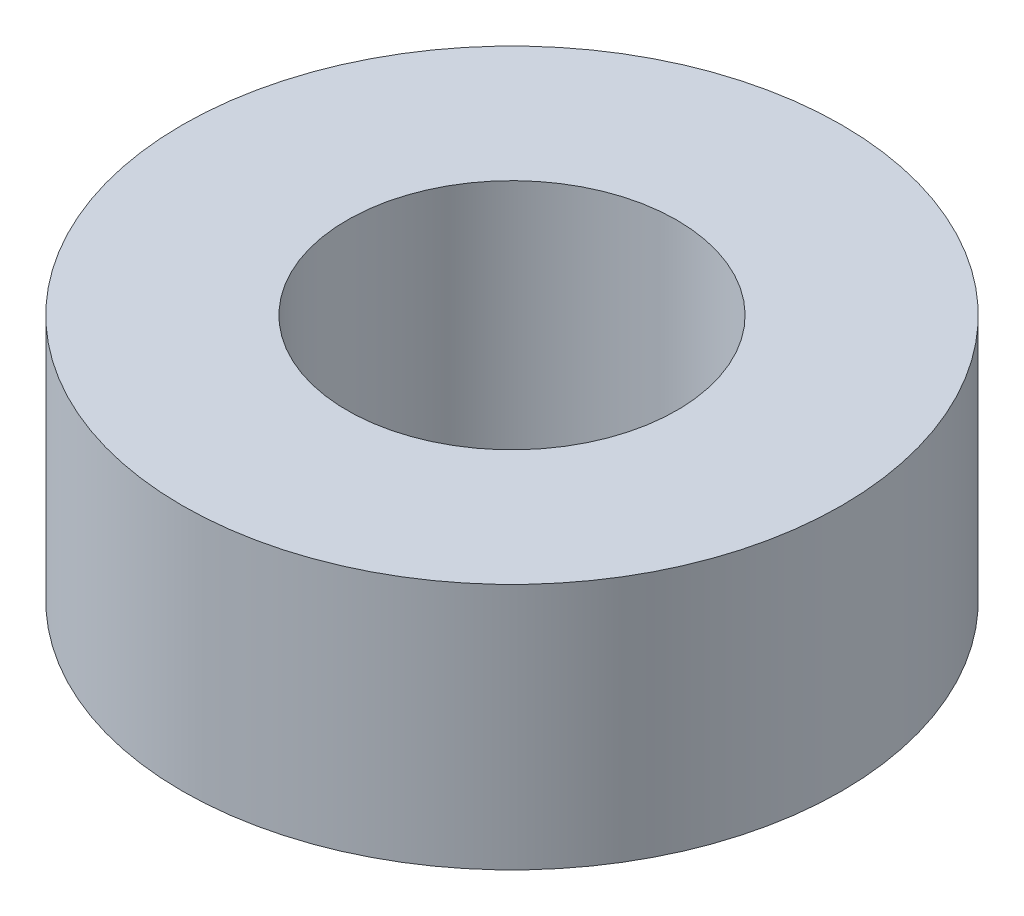
ISO-10303-21;
HEADER;
FILE_DESCRIPTION(('STEP AP214'),'2;1');
FILE_NAME('part.step','',(''),(''),'','','');
FILE_SCHEMA(('AUTOMOTIVE_DESIGN { 1 0 10303 214 1 1 1 1 }'));
ENDSEC;
DATA;
#1=APPLICATION_CONTEXT('core data for automotive mechanical design processes');
#2=APPLICATION_PROTOCOL_DEFINITION('international standard','automotive_design',2000,#1);
#3=PRODUCT_CONTEXT('',#1,'mechanical');
#4=PRODUCT('Part','Part','',(#3));
#5=PRODUCT_RELATED_PRODUCT_CATEGORY('part','',(#4));
#6=PRODUCT_DEFINITION_FORMATION('','',#4);
#7=PRODUCT_DEFINITION_CONTEXT('part definition',#1,'design');
#8=PRODUCT_DEFINITION('design','',#6,#7);
#9=PRODUCT_DEFINITION_SHAPE('','',#8);
#10=(LENGTH_UNIT() NAMED_UNIT(*) SI_UNIT(.MILLI.,.METRE.));
#11=(NAMED_UNIT(*) PLANE_ANGLE_UNIT() SI_UNIT($,.RADIAN.));
#12=(NAMED_UNIT(*) SI_UNIT($,.STERADIAN.) SOLID_ANGLE_UNIT());
#13=UNCERTAINTY_MEASURE_WITH_UNIT(LENGTH_MEASURE(1.E-05),#10,'distance_accuracy_value','');
#14=(GEOMETRIC_REPRESENTATION_CONTEXT(3) GLOBAL_UNCERTAINTY_ASSIGNED_CONTEXT((#13)) GLOBAL_UNIT_ASSIGNED_CONTEXT((#10,
#11,#12)) REPRESENTATION_CONTEXT('',''));
#15=CARTESIAN_POINT('',(0.,0.,0.));
#16=DIRECTION('',(0.,0.,1.));
#17=DIRECTION('',(1.,0.,0.));
#18=AXIS2_PLACEMENT_3D('',#15,#16,#17);
#19=CARTESIAN_POINT('',(0.,4.7625,0.));
#20=DIRECTION('',(0.,1.,0.));
#21=DIRECTION('',(0.,0.,1.));
#22=AXIS2_PLACEMENT_3D('',#19,#20,#21);
#23=PLANE('',#22);
#24=CARTESIAN_POINT('',(0.,4.7625,0.));
#25=DIRECTION('',(0.,1.,0.));
#26=DIRECTION('',(0.,0.,1.));
#27=AXIS2_PLACEMENT_3D('',#24,#25,#26);
#28=CIRCLE('',#27,6.35);
#29=CARTESIAN_POINT('',(0.,4.7625,-6.35));
#30=VERTEX_POINT('',#29);
#31=EDGE_CURVE('E10',#30,#30,#28,.T.);
#32=ORIENTED_EDGE('',*,*,#31,.T.);
#33=EDGE_LOOP('',(#32));
#34=FACE_BOUND('',#33,.T.);
#35=CARTESIAN_POINT('',(0.,4.7625,0.));
#36=DIRECTION('',(0.,1.,0.));
#37=DIRECTION('',(0.,0.,1.));
#38=AXIS2_PLACEMENT_3D('',#35,#36,#37);
#39=CIRCLE('',#38,3.175);
#40=CARTESIAN_POINT('',(0.,4.7625,-3.175));
#41=VERTEX_POINT('',#40);
#42=EDGE_CURVE('E44',#41,#41,#39,.T.);
#43=ORIENTED_EDGE('',*,*,#42,.F.);
#44=EDGE_LOOP('',(#43));
#45=FACE_BOUND('',#44,.T.);
#46=ADVANCED_FACE('F33',(#34,#45),#23,.T.);
#47=CARTESIAN_POINT('',(0.,0.,0.));
#48=DIRECTION('',(0.,1.,0.));
#49=DIRECTION('',(0.,0.,1.));
#50=AXIS2_PLACEMENT_3D('',#47,#48,#49);
#51=PLANE('',#50);
#52=CARTESIAN_POINT('',(0.,0.,0.));
#53=DIRECTION('',(0.,1.,0.));
#54=DIRECTION('',(0.,0.,1.));
#55=AXIS2_PLACEMENT_3D('',#52,#53,#54);
#56=CIRCLE('',#55,6.35);
#57=CARTESIAN_POINT('',(0.,0.,-6.35));
#58=VERTEX_POINT('',#57);
#59=EDGE_CURVE('E37',#58,#58,#56,.T.);
#60=ORIENTED_EDGE('',*,*,#59,.F.);
#61=EDGE_LOOP('',(#60));
#62=FACE_BOUND('',#61,.T.);
#63=CARTESIAN_POINT('',(0.,0.,0.));
#64=DIRECTION('',(0.,1.,0.));
#65=DIRECTION('',(0.,0.,1.));
#66=AXIS2_PLACEMENT_3D('',#63,#64,#65);
#67=CIRCLE('',#66,3.175);
#68=CARTESIAN_POINT('',(0.,0.,-3.175));
#69=VERTEX_POINT('',#68);
#70=EDGE_CURVE('E46',#69,#69,#67,.T.);
#71=ORIENTED_EDGE('',*,*,#70,.T.);
#72=EDGE_LOOP('',(#71));
#73=FACE_BOUND('',#72,.T.);
#74=ADVANCED_FACE('F56',(#62,#73),#51,.F.);
#75=CARTESIAN_POINT('',(0.,4.7625,0.));
#76=DIRECTION('',(0.,-1.,0.));
#77=DIRECTION('',(0.,0.,-1.));
#78=AXIS2_PLACEMENT_3D('',#75,#76,#77);
#79=CYLINDRICAL_SURFACE('',#78,6.35);
#80=CARTESIAN_POINT('',(0.,4.7625,-6.35));
#81=CARTESIAN_POINT('',(0.,4.712890625,-6.35));
#82=CARTESIAN_POINT('',(0.,4.66328125,-6.35));
#83=CARTESIAN_POINT('',(0.,4.5640625,-6.35));
#84=CARTESIAN_POINT('',(0.,4.514453125,-6.35));
#85=CARTESIAN_POINT('',(0.,4.415234375,-6.35));
#86=CARTESIAN_POINT('',(0.,4.365625,-6.35));
#87=CARTESIAN_POINT('',(0.,4.26640625,-6.35));
#88=CARTESIAN_POINT('',(0.,4.216796875,-6.35));
#89=CARTESIAN_POINT('',(0.,4.117578125,-6.35));
#90=CARTESIAN_POINT('',(0.,4.06796875,-6.35));
#91=CARTESIAN_POINT('',(0.,3.96875,-6.35));
#92=CARTESIAN_POINT('',(0.,3.919140625,-6.35));
#93=CARTESIAN_POINT('',(0.,3.819921875,-6.35));
#94=CARTESIAN_POINT('',(0.,3.7703125,-6.35));
#95=CARTESIAN_POINT('',(0.,3.67109375,-6.35));
#96=CARTESIAN_POINT('',(0.,3.621484375,-6.35));
#97=CARTESIAN_POINT('',(0.,3.522265625,-6.35));
#98=CARTESIAN_POINT('',(0.,3.47265625,-6.35));
#99=CARTESIAN_POINT('',(0.,3.3734375,-6.35));
#100=CARTESIAN_POINT('',(0.,3.323828125,-6.35));
#101=CARTESIAN_POINT('',(0.,3.224609375,-6.35));
#102=CARTESIAN_POINT('',(0.,3.175,-6.35));
#103=CARTESIAN_POINT('',(0.,3.07578125,-6.35));
#104=CARTESIAN_POINT('',(0.,3.026171875,-6.35));
#105=CARTESIAN_POINT('',(0.,2.926953125,-6.35));
#106=CARTESIAN_POINT('',(0.,2.87734375,-6.35));
#107=CARTESIAN_POINT('',(0.,2.778125,-6.35));
#108=CARTESIAN_POINT('',(0.,2.728515625,-6.35));
#109=CARTESIAN_POINT('',(0.,2.629296875,-6.35));
#110=CARTESIAN_POINT('',(0.,2.5796875,-6.35));
#111=CARTESIAN_POINT('',(0.,2.48046875,-6.35));
#112=CARTESIAN_POINT('',(0.,2.430859375,-6.35));
#113=CARTESIAN_POINT('',(0.,2.331640625,-6.35));
#114=CARTESIAN_POINT('',(0.,2.28203125,-6.35));
#115=CARTESIAN_POINT('',(0.,2.1828125,-6.35));
#116=CARTESIAN_POINT('',(0.,2.133203125,-6.35));
#117=CARTESIAN_POINT('',(0.,2.033984375,-6.35));
#118=CARTESIAN_POINT('',(0.,1.984375,-6.35));
#119=CARTESIAN_POINT('',(0.,1.88515625,-6.35));
#120=CARTESIAN_POINT('',(0.,1.835546875,-6.35));
#121=CARTESIAN_POINT('',(0.,1.736328125,-6.35));
#122=CARTESIAN_POINT('',(0.,1.68671875,-6.35));
#123=CARTESIAN_POINT('',(0.,1.5875,-6.35));
#124=CARTESIAN_POINT('',(0.,1.537890625,-6.35));
#125=CARTESIAN_POINT('',(0.,1.438671875,-6.35));
#126=CARTESIAN_POINT('',(0.,1.3890625,-6.35));
#127=CARTESIAN_POINT('',(0.,1.28984375,-6.35));
#128=CARTESIAN_POINT('',(0.,1.240234375,-6.35));
#129=CARTESIAN_POINT('',(0.,1.141015625,-6.35));
#130=CARTESIAN_POINT('',(0.,1.09140625,-6.35));
#131=CARTESIAN_POINT('',(0.,0.992187499999999,-6.35));
#132=CARTESIAN_POINT('',(0.,0.942578124999999,-6.35));
#133=CARTESIAN_POINT('',(0.,0.843359375,-6.35));
#134=CARTESIAN_POINT('',(0.,0.79375,-6.35));
#135=CARTESIAN_POINT('',(0.,0.69453125,-6.35));
#136=CARTESIAN_POINT('',(0.,0.644921875,-6.35));
#137=CARTESIAN_POINT('',(0.,0.545703125,-6.35));
#138=CARTESIAN_POINT('',(0.,0.49609375,-6.35));
#139=CARTESIAN_POINT('',(0.,0.396875,-6.35));
#140=CARTESIAN_POINT('',(0.,0.347265625,-6.35));
#141=CARTESIAN_POINT('',(0.,0.248046875,-6.35));
#142=CARTESIAN_POINT('',(0.,0.1984375,-6.35));
#143=CARTESIAN_POINT('',(0.,0.09921875,-6.35));
#144=CARTESIAN_POINT('',(0.,0.049609375,-6.35));
#145=CARTESIAN_POINT('',(0.,0.,-6.35));
#146=B_SPLINE_CURVE_WITH_KNOTS('',3,(#80,#81,#82,#83,#84,#85,#86,#87,#88,#89,#90,#91,#92,#93,
#94,#95,#96,#97,#98,#99,#100,#101,#102,#103,#104,#105,#106,#107,#108,#109,#110,#111,#112,#113,
#114,#115,#116,#117,#118,#119,#120,#121,#122,#123,#124,#125,#126,#127,#128,#129,#130,#131,#132,
#133,#134,#135,#136,#137,#138,#139,#140,#141,#142,#143,#144,#145),.UNSPECIFIED.,.F.,.F.,(4,2,2,
2,2,2,2,2,2,2,2,2,2,2,2,2,2,2,2,2,2,2,2,2,2,2,2,2,2,2,2,2,4),(0.,0.148828125,0.29765625,
0.446484375,0.5953125,0.744140625,0.892968750000001,1.041796875,1.190625,1.339453125,1.48828125,
1.637109375,1.7859375,1.934765625,2.08359375,2.232421875,2.38125,2.530078125,2.67890625,
2.827734375,2.9765625,3.125390625,3.27421875,3.423046875,3.571875,3.720703125,3.86953125,
4.018359375,4.1671875,4.316015625,4.46484375,4.613671875,4.7625),.UNSPECIFIED.);
#147=EDGE_CURVE('BSEAM35',#30,#58,#146,.T.);
#148=ORIENTED_EDGE('',*,*,#31,.F.);
#149=ORIENTED_EDGE('',*,*,#59,.T.);
#150=ORIENTED_EDGE('',*,*,#147,.T.);
#151=ORIENTED_EDGE('',*,*,#147,.F.);
#152=EDGE_LOOP('',(#148,#150,#149,#151));
#153=FACE_BOUND('',#152,.T.);
#154=ADVANCED_FACE('F35',(#153),#79,.T.);
#155=CARTESIAN_POINT('',(0.,4.7625,0.));
#156=DIRECTION('',(0.,-1.,0.));
#157=DIRECTION('',(0.,0.,-1.));
#158=AXIS2_PLACEMENT_3D('',#155,#156,#157);
#159=CYLINDRICAL_SURFACE('',#158,3.175);
#160=CARTESIAN_POINT('',(0.,4.7625,-3.175));
#161=CARTESIAN_POINT('',(0.,4.712890625,-3.175));
#162=CARTESIAN_POINT('',(0.,4.66328125,-3.175));
#163=CARTESIAN_POINT('',(0.,4.5640625,-3.175));
#164=CARTESIAN_POINT('',(0.,4.514453125,-3.175));
#165=CARTESIAN_POINT('',(0.,4.415234375,-3.175));
#166=CARTESIAN_POINT('',(0.,4.365625,-3.175));
#167=CARTESIAN_POINT('',(0.,4.26640625,-3.175));
#168=CARTESIAN_POINT('',(0.,4.216796875,-3.175));
#169=CARTESIAN_POINT('',(0.,4.117578125,-3.175));
#170=CARTESIAN_POINT('',(0.,4.06796875,-3.175));
#171=CARTESIAN_POINT('',(0.,3.96875,-3.175));
#172=CARTESIAN_POINT('',(0.,3.919140625,-3.175));
#173=CARTESIAN_POINT('',(0.,3.819921875,-3.175));
#174=CARTESIAN_POINT('',(0.,3.7703125,-3.175));
#175=CARTESIAN_POINT('',(0.,3.67109375,-3.175));
#176=CARTESIAN_POINT('',(0.,3.621484375,-3.175));
#177=CARTESIAN_POINT('',(0.,3.522265625,-3.175));
#178=CARTESIAN_POINT('',(0.,3.47265625,-3.175));
#179=CARTESIAN_POINT('',(0.,3.3734375,-3.175));
#180=CARTESIAN_POINT('',(0.,3.323828125,-3.175));
#181=CARTESIAN_POINT('',(0.,3.224609375,-3.175));
#182=CARTESIAN_POINT('',(0.,3.175,-3.175));
#183=CARTESIAN_POINT('',(0.,3.07578125,-3.175));
#184=CARTESIAN_POINT('',(0.,3.026171875,-3.175));
#185=CARTESIAN_POINT('',(0.,2.926953125,-3.175));
#186=CARTESIAN_POINT('',(0.,2.87734375,-3.175));
#187=CARTESIAN_POINT('',(0.,2.778125,-3.175));
#188=CARTESIAN_POINT('',(0.,2.728515625,-3.175));
#189=CARTESIAN_POINT('',(0.,2.629296875,-3.175));
#190=CARTESIAN_POINT('',(0.,2.5796875,-3.175));
#191=CARTESIAN_POINT('',(0.,2.48046875,-3.175));
#192=CARTESIAN_POINT('',(0.,2.430859375,-3.175));
#193=CARTESIAN_POINT('',(0.,2.331640625,-3.175));
#194=CARTESIAN_POINT('',(0.,2.28203125,-3.175));
#195=CARTESIAN_POINT('',(0.,2.1828125,-3.175));
#196=CARTESIAN_POINT('',(0.,2.133203125,-3.175));
#197=CARTESIAN_POINT('',(0.,2.033984375,-3.175));
#198=CARTESIAN_POINT('',(0.,1.984375,-3.175));
#199=CARTESIAN_POINT('',(0.,1.88515625,-3.175));
#200=CARTESIAN_POINT('',(0.,1.835546875,-3.175));
#201=CARTESIAN_POINT('',(0.,1.736328125,-3.175));
#202=CARTESIAN_POINT('',(0.,1.68671875,-3.175));
#203=CARTESIAN_POINT('',(0.,1.5875,-3.175));
#204=CARTESIAN_POINT('',(0.,1.537890625,-3.175));
#205=CARTESIAN_POINT('',(0.,1.438671875,-3.175));
#206=CARTESIAN_POINT('',(0.,1.3890625,-3.175));
#207=CARTESIAN_POINT('',(0.,1.28984375,-3.175));
#208=CARTESIAN_POINT('',(0.,1.240234375,-3.175));
#209=CARTESIAN_POINT('',(0.,1.141015625,-3.175));
#210=CARTESIAN_POINT('',(0.,1.09140625,-3.175));
#211=CARTESIAN_POINT('',(0.,0.9921875,-3.175));
#212=CARTESIAN_POINT('',(0.,0.942578125,-3.175));
#213=CARTESIAN_POINT('',(0.,0.843359375,-3.175));
#214=CARTESIAN_POINT('',(0.,0.79375,-3.175));
#215=CARTESIAN_POINT('',(0.,0.69453125,-3.175));
#216=CARTESIAN_POINT('',(0.,0.644921875,-3.175));
#217=CARTESIAN_POINT('',(0.,0.545703125,-3.175));
#218=CARTESIAN_POINT('',(0.,0.49609375,-3.175));
#219=CARTESIAN_POINT('',(0.,0.396875,-3.175));
#220=CARTESIAN_POINT('',(0.,0.347265625,-3.175));
#221=CARTESIAN_POINT('',(0.,0.248046875,-3.175));
#222=CARTESIAN_POINT('',(0.,0.1984375,-3.175));
#223=CARTESIAN_POINT('',(0.,0.09921875,-3.175));
#224=CARTESIAN_POINT('',(0.,0.049609375,-3.175));
#225=CARTESIAN_POINT('',(0.,0.,-3.175));
#226=B_SPLINE_CURVE_WITH_KNOTS('',3,(#160,#161,#162,#163,#164,#165,#166,#167,#168,#169,#170,
#171,#172,#173,#174,#175,#176,#177,#178,#179,#180,#181,#182,#183,#184,#185,#186,#187,#188,#189,
#190,#191,#192,#193,#194,#195,#196,#197,#198,#199,#200,#201,#202,#203,#204,#205,#206,#207,#208,
#209,#210,#211,#212,#213,#214,#215,#216,#217,#218,#219,#220,#221,#222,#223,#224,#225),
.UNSPECIFIED.,.F.,.F.,(4,2,2,2,2,2,2,2,2,2,2,2,2,2,2,2,2,2,2,2,2,2,2,2,2,2,2,2,2,2,2,2,4),(0.,
0.148828124999999,0.297656249999999,0.446484374999999,0.595312499999999,0.744140625,0.89296875,
1.041796875,1.190625,1.339453125,1.48828125,1.637109375,1.7859375,1.934765625,2.08359375,
2.232421875,2.38125,2.530078125,2.67890625,2.827734375,2.9765625,3.125390625,3.27421875,
3.423046875,3.571875,3.720703125,3.86953125,4.018359375,4.1671875,4.316015625,4.46484375,
4.613671875,4.7625),.UNSPECIFIED.);
#227=EDGE_CURVE('BSEAM52',#41,#69,#226,.T.);
#228=ORIENTED_EDGE('',*,*,#42,.T.);
#229=ORIENTED_EDGE('',*,*,#70,.F.);
#230=ORIENTED_EDGE('',*,*,#227,.T.);
#231=ORIENTED_EDGE('',*,*,#227,.F.);
#232=EDGE_LOOP('',(#228,#230,#229,#231));
#233=FACE_BOUND('',#232,.T.);
#234=ADVANCED_FACE('F52',(#233),#159,.F.);
#235=CLOSED_SHELL('',(#46,#74,#154,#234));
#236=MANIFOLD_SOLID_BREP('B2',#235);
#237=ADVANCED_BREP_SHAPE_REPRESENTATION('',(#18,#236),#14);
#238=SHAPE_DEFINITION_REPRESENTATION(#9,#237);
ENDSEC;
END-ISO-10303-21;
